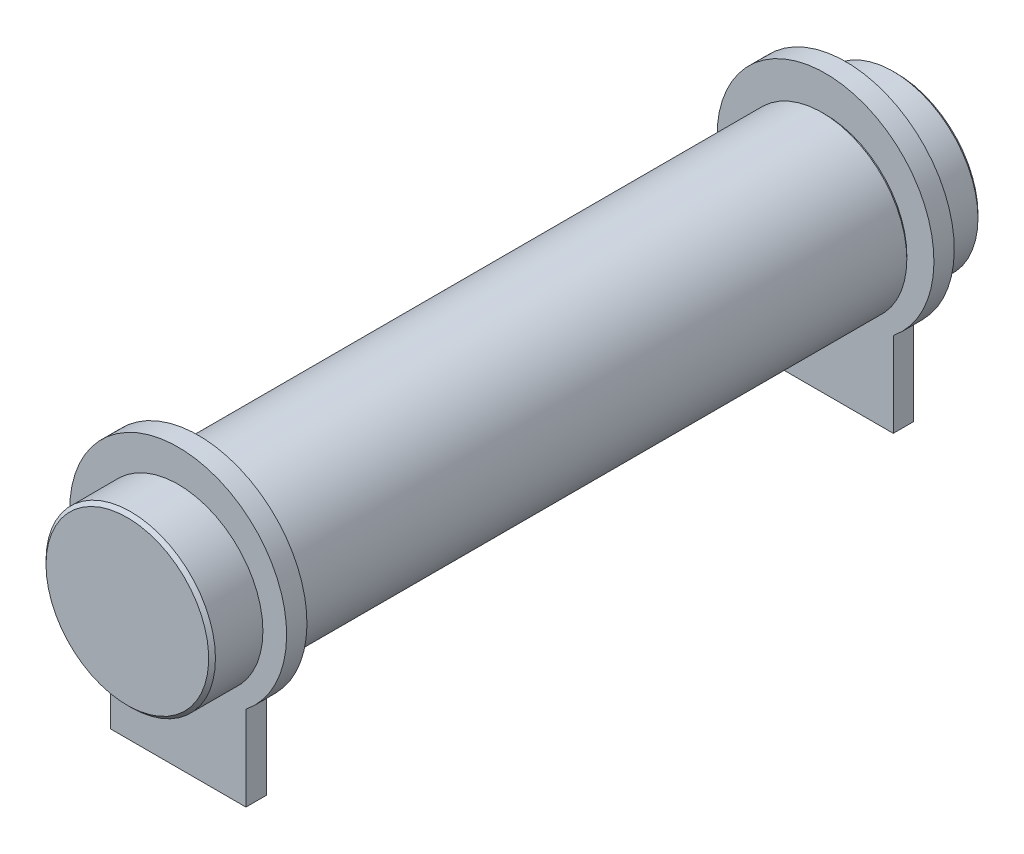
ISO-10303-21;
HEADER;
FILE_DESCRIPTION(('STEP AP214'),'2;1');
FILE_NAME('part.step','',(''),(''),'','','');
FILE_SCHEMA(('AUTOMOTIVE_DESIGN { 1 0 10303 214 1 1 1 1 }'));
ENDSEC;
DATA;
#1=APPLICATION_CONTEXT('core data for automotive mechanical design processes');
#2=APPLICATION_PROTOCOL_DEFINITION('international standard','automotive_design',2000,#1);
#3=PRODUCT_CONTEXT('',#1,'mechanical');
#4=PRODUCT('Part','Part','',(#3));
#5=PRODUCT_RELATED_PRODUCT_CATEGORY('part','',(#4));
#6=PRODUCT_DEFINITION_FORMATION('','',#4);
#7=PRODUCT_DEFINITION_CONTEXT('part definition',#1,'design');
#8=PRODUCT_DEFINITION('design','',#6,#7);
#9=PRODUCT_DEFINITION_SHAPE('','',#8);
#10=(LENGTH_UNIT() NAMED_UNIT(*) SI_UNIT(.MILLI.,.METRE.));
#11=(NAMED_UNIT(*) PLANE_ANGLE_UNIT() SI_UNIT($,.RADIAN.));
#12=(NAMED_UNIT(*) SI_UNIT($,.STERADIAN.) SOLID_ANGLE_UNIT());
#13=UNCERTAINTY_MEASURE_WITH_UNIT(LENGTH_MEASURE(1.E-05),#10,'distance_accuracy_value','');
#14=(GEOMETRIC_REPRESENTATION_CONTEXT(3) GLOBAL_UNCERTAINTY_ASSIGNED_CONTEXT((#13)) GLOBAL_UNIT_ASSIGNED_CONTEXT((#10,
#11,#12)) REPRESENTATION_CONTEXT('',''));
#15=CARTESIAN_POINT('',(0.,0.,0.));
#16=DIRECTION('',(0.,0.,1.));
#17=DIRECTION('',(1.,0.,0.));
#18=AXIS2_PLACEMENT_3D('',#15,#16,#17);
#19=CARTESIAN_POINT('',(2.5,-2.5,9.15));
#20=DIRECTION('',(0.,0.,1.));
#21=DIRECTION('',(0.,1.,0.));
#22=AXIS2_PLACEMENT_3D('',#19,#20,#21);
#23=PLANE('',#22);
#24=CARTESIAN_POINT('',(0.,0.,9.15));
#25=DIRECTION('',(0.,0.,1.));
#26=DIRECTION('',(-1.,0.,0.));
#27=AXIS2_PLACEMENT_3D('',#24,#25,#26);
#28=CIRCLE('',#27,2.5);
#29=CARTESIAN_POINT('',(-2.5,0.,9.15));
#30=VERTEX_POINT('',#29);
#31=EDGE_CURVE('E353',#30,#30,#28,.F.);
#32=ORIENTED_EDGE('',*,*,#31,.F.);
#33=EDGE_LOOP('',(#32));
#34=FACE_BOUND('',#33,.T.);
#35=CARTESIAN_POINT('',(0.,0.,9.15));
#36=DIRECTION('',(0.,0.,-1.));
#37=DIRECTION('',(0.99999999999999,-1.41766347920107E-07,0.));
#38=AXIS2_PLACEMENT_3D('',#35,#36,#37);
#39=CIRCLE('',#38,2.4);
#40=CARTESIAN_POINT('',(2.39999999999998,-3.40239235008257E-07,9.15));
#41=VERTEX_POINT('',#40);
#42=EDGE_CURVE('E348',#41,#41,#39,.T.);
#43=ORIENTED_EDGE('',*,*,#42,.T.);
#44=EDGE_LOOP('',(#43));
#45=FACE_BOUND('',#44,.T.);
#46=ADVANCED_FACE('F16',(#34,#45),#23,.T.);
#47=CARTESIAN_POINT('',(-2.5,-2.49999987914998,-9.15));
#48=DIRECTION('',(0.,0.,-1.));
#49=DIRECTION('',(0.,1.,0.));
#50=AXIS2_PLACEMENT_3D('',#47,#48,#49);
#51=PLANE('',#50);
#52=CARTESIAN_POINT('',(0.,0.,-9.15));
#53=DIRECTION('',(0.,0.,-1.));
#54=DIRECTION('',(0.99999999999999,-1.41721898572201E-07,0.));
#55=AXIS2_PLACEMENT_3D('',#52,#53,#54);
#56=CIRCLE('',#55,2.5);
#57=CARTESIAN_POINT('',(2.49999999999997,-3.54304746430502E-07,-9.15));
#58=VERTEX_POINT('',#57);
#59=EDGE_CURVE('E345',#58,#58,#56,.T.);
#60=ORIENTED_EDGE('',*,*,#59,.T.);
#61=EDGE_LOOP('',(#60));
#62=FACE_BOUND('',#61,.T.);
#63=CARTESIAN_POINT('',(0.,0.,-9.15));
#64=DIRECTION('',(0.,0.,1.));
#65=DIRECTION('',(-1.,0.,0.));
#66=AXIS2_PLACEMENT_3D('',#63,#64,#65);
#67=CIRCLE('',#66,2.4);
#68=CARTESIAN_POINT('',(-2.4,0.,-9.15));
#69=VERTEX_POINT('',#68);
#70=EDGE_CURVE('E103',#69,#69,#67,.F.);
#71=ORIENTED_EDGE('',*,*,#70,.F.);
#72=EDGE_LOOP('',(#71));
#73=FACE_BOUND('',#72,.T.);
#74=ADVANCED_FACE('F246',(#62,#73),#51,.T.);
#75=CARTESIAN_POINT('',(2.,-4.75,9.85));
#76=DIRECTION('',(1.,0.,0.));
#77=DIRECTION('',(0.,0.,-1.));
#78=AXIS2_PLACEMENT_3D('',#75,#76,#77);
#79=PLANE('',#78);
#80=DIRECTION('',(0.,-1.,0.));
#81=VECTOR('',#80,1.);
#82=CARTESIAN_POINT('',(2.,-2.24799919935939,9.85));
#83=LINE('',#82,#81);
#84=CARTESIAN_POINT('',(2.,-4.75,9.85));
#85=VERTEX_POINT('',#84);
#86=CARTESIAN_POINT('',(2.,-2.24799919935939,9.85));
#87=VERTEX_POINT('',#86);
#88=EDGE_CURVE('E84',#85,#87,#83,.F.);
#89=ORIENTED_EDGE('',*,*,#88,.F.);
#90=DIRECTION('',(0.,0.,-1.));
#91=VECTOR('',#90,1.);
#92=CARTESIAN_POINT('',(2.,-4.75,9.85));
#93=LINE('',#92,#91);
#94=CARTESIAN_POINT('',(2.,-4.75,9.25));
#95=VERTEX_POINT('',#94);
#96=EDGE_CURVE('E100',#95,#85,#93,.F.);
#97=ORIENTED_EDGE('',*,*,#96,.F.);
#98=DIRECTION('',(0.,1.,0.));
#99=VECTOR('',#98,1.);
#100=CARTESIAN_POINT('',(2.,-4.75,9.25));
#101=LINE('',#100,#99);
#102=CARTESIAN_POINT('',(2.,-2.24799919935939,9.25));
#103=VERTEX_POINT('',#102);
#104=EDGE_CURVE('E107',#95,#103,#101,.T.);
#105=ORIENTED_EDGE('',*,*,#104,.T.);
#106=DIRECTION('',(0.,0.,1.));
#107=VECTOR('',#106,1.);
#108=CARTESIAN_POINT('',(2.,-2.24799919935939,9.25));
#109=LINE('',#108,#107);
#110=EDGE_CURVE('E102',#103,#87,#109,.T.);
#111=ORIENTED_EDGE('',*,*,#110,.T.);
#112=EDGE_LOOP('',(#89,#97,#105,#111));
#113=FACE_BOUND('',#112,.T.);
#114=ADVANCED_FACE('F98',(#113),#79,.T.);
#115=CARTESIAN_POINT('',(0.,0.249999999999982,9.25));
#116=DIRECTION('',(0.,0.,1.));
#117=DIRECTION('',(0.,1.,0.));
#118=AXIS2_PLACEMENT_3D('',#115,#116,#117);
#119=CYLINDRICAL_SURFACE('',#118,3.2);
#120=DIRECTION('',(0.,0.,1.));
#121=VECTOR('',#120,1.);
#122=CARTESIAN_POINT('',(-1.99999999999999,-2.24799919935939,9.25));
#123=LINE('',#122,#121);
#124=CARTESIAN_POINT('',(-1.99999999999999,-2.24799919935938,9.25));
#125=VERTEX_POINT('',#124);
#126=CARTESIAN_POINT('',(-1.99999999999999,-2.24799919935939,9.85));
#127=VERTEX_POINT('',#126);
#128=EDGE_CURVE('E118',#125,#127,#123,.T.);
#129=ORIENTED_EDGE('',*,*,#128,.T.);
#130=CARTESIAN_POINT('',(0.,0.249999999999982,9.85));
#131=DIRECTION('',(0.,0.,-1.));
#132=DIRECTION('',(-0.624999999999997,-0.780624749799802,0.));
#133=AXIS2_PLACEMENT_3D('',#130,#131,#132);
#134=CIRCLE('',#133,3.2);
#135=EDGE_CURVE('E123',#87,#127,#134,.F.);
#136=ORIENTED_EDGE('',*,*,#135,.F.);
#137=ORIENTED_EDGE('',*,*,#110,.F.);
#138=CARTESIAN_POINT('',(0.,0.249999999999982,9.25));
#139=DIRECTION('',(0.,0.,1.));
#140=DIRECTION('',(0.624999999999997,-0.780624749799802,0.));
#141=AXIS2_PLACEMENT_3D('',#138,#139,#140);
#142=CIRCLE('',#141,3.2);
#143=EDGE_CURVE('E127',#103,#125,#142,.T.);
#144=ORIENTED_EDGE('',*,*,#143,.T.);
#145=EDGE_LOOP('',(#129,#136,#137,#144));
#146=FACE_BOUND('',#145,.T.);
#147=ADVANCED_FACE('F259',(#146),#119,.T.);
#148=CARTESIAN_POINT('',(-2.,-4.75,9.25));
#149=DIRECTION('',(-1.,0.,0.));
#150=DIRECTION('',(0.,0.,1.));
#151=AXIS2_PLACEMENT_3D('',#148,#149,#150);
#152=PLANE('',#151);
#153=DIRECTION('',(0.,1.,0.));
#154=VECTOR('',#153,1.);
#155=CARTESIAN_POINT('',(-2.,-4.75,9.85));
#156=LINE('',#155,#154);
#157=CARTESIAN_POINT('',(-2.,-4.75,9.85));
#158=VERTEX_POINT('',#157);
#159=EDGE_CURVE('E87',#127,#158,#156,.F.);
#160=ORIENTED_EDGE('',*,*,#159,.F.);
#161=ORIENTED_EDGE('',*,*,#128,.F.);
#162=DIRECTION('',(0.,-1.,0.));
#163=VECTOR('',#162,1.);
#164=CARTESIAN_POINT('',(-2.,-2.24799919935939,9.25));
#165=LINE('',#164,#163);
#166=CARTESIAN_POINT('',(-2.,-4.75,9.25));
#167=VERTEX_POINT('',#166);
#168=EDGE_CURVE('E135',#125,#167,#165,.T.);
#169=ORIENTED_EDGE('',*,*,#168,.T.);
#170=DIRECTION('',(0.,0.,1.));
#171=VECTOR('',#170,1.);
#172=CARTESIAN_POINT('',(-2.,-4.75,9.25));
#173=LINE('',#172,#171);
#174=EDGE_CURVE('E93',#167,#158,#173,.T.);
#175=ORIENTED_EDGE('',*,*,#174,.T.);
#176=EDGE_LOOP('',(#160,#161,#169,#175));
#177=FACE_BOUND('',#176,.T.);
#178=ADVANCED_FACE('F262',(#177),#152,.T.);
#179=CARTESIAN_POINT('',(-2.,-4.75,9.85));
#180=DIRECTION('',(0.,-1.,0.));
#181=DIRECTION('',(0.,0.,-1.));
#182=AXIS2_PLACEMENT_3D('',#179,#180,#181);
#183=PLANE('',#182);
#184=DIRECTION('',(-1.,0.,0.));
#185=VECTOR('',#184,1.);
#186=CARTESIAN_POINT('',(2.,-4.75,9.85));
#187=LINE('',#186,#185);
#188=EDGE_CURVE('E80',#158,#85,#187,.F.);
#189=ORIENTED_EDGE('',*,*,#188,.F.);
#190=ORIENTED_EDGE('',*,*,#174,.F.);
#191=DIRECTION('',(1.,0.,0.));
#192=VECTOR('',#191,1.);
#193=CARTESIAN_POINT('',(-2.,-4.75,9.25));
#194=LINE('',#193,#192);
#195=EDGE_CURVE('E92',#167,#95,#194,.T.);
#196=ORIENTED_EDGE('',*,*,#195,.T.);
#197=ORIENTED_EDGE('',*,*,#96,.T.);
#198=EDGE_LOOP('',(#189,#190,#196,#197));
#199=FACE_BOUND('',#198,.T.);
#200=ADVANCED_FACE('F106',(#199),#183,.T.);
#201=CARTESIAN_POINT('',(-3.21954510231242,-4.75,9.25));
#202=DIRECTION('',(0.,0.,-1.));
#203=DIRECTION('',(0.,1.,0.));
#204=AXIS2_PLACEMENT_3D('',#201,#202,#203);
#205=PLANE('',#204);
#206=ORIENTED_EDGE('',*,*,#143,.F.);
#207=ORIENTED_EDGE('',*,*,#104,.F.);
#208=ORIENTED_EDGE('',*,*,#195,.F.);
#209=ORIENTED_EDGE('',*,*,#168,.F.);
#210=EDGE_LOOP('',(#206,#207,#208,#209));
#211=FACE_BOUND('',#210,.T.);
#212=CARTESIAN_POINT('',(0.,0.,9.25));
#213=DIRECTION('',(0.,0.,1.));
#214=DIRECTION('',(-0.99999999999999,-1.42053887171776E-07,0.));
#215=AXIS2_PLACEMENT_3D('',#212,#213,#214);
#216=CIRCLE('',#215,2.4);
#217=CARTESIAN_POINT('',(-2.39999999999998,-3.40929329212263E-07,9.25));
#218=VERTEX_POINT('',#217);
#219=EDGE_CURVE('E148',#218,#218,#216,.T.);
#220=ORIENTED_EDGE('',*,*,#219,.T.);
#221=EDGE_LOOP('',(#220));
#222=FACE_BOUND('',#221,.T.);
#223=ADVANCED_FACE('F243',(#211,#222),#205,.T.);
#224=CARTESIAN_POINT('',(-3.21954510231242,-4.75,9.85));
#225=DIRECTION('',(0.,0.,1.));
#226=DIRECTION('',(1.,0.,0.));
#227=AXIS2_PLACEMENT_3D('',#224,#225,#226);
#228=PLANE('',#227);
#229=ORIENTED_EDGE('',*,*,#88,.T.);
#230=ORIENTED_EDGE('',*,*,#135,.T.);
#231=ORIENTED_EDGE('',*,*,#159,.T.);
#232=ORIENTED_EDGE('',*,*,#188,.T.);
#233=EDGE_LOOP('',(#229,#230,#231,#232));
#234=FACE_BOUND('',#233,.T.);
#235=CARTESIAN_POINT('',(0.,0.,9.85));
#236=DIRECTION('',(0.,0.,-1.));
#237=DIRECTION('',(0.99999999999999,-1.42053901797114E-07,0.));
#238=AXIS2_PLACEMENT_3D('',#235,#236,#237);
#239=CIRCLE('',#238,2.5);
#240=CARTESIAN_POINT('',(2.49999999999997,-3.55134754492786E-07,9.85));
#241=VERTEX_POINT('',#240);
#242=EDGE_CURVE('E153',#241,#241,#239,.T.);
#243=ORIENTED_EDGE('',*,*,#242,.T.);
#244=EDGE_LOOP('',(#243));
#245=FACE_BOUND('',#244,.T.);
#246=ADVANCED_FACE('F82',(#234,#245),#228,.T.);
#247=CARTESIAN_POINT('',(2.40000018407145,-2.39999988382605,11.35));
#248=DIRECTION('',(0.,0.,1.));
#249=DIRECTION('',(0.,1.,0.));
#250=AXIS2_PLACEMENT_3D('',#247,#248,#249);
#251=PLANE('',#250);
#252=CARTESIAN_POINT('',(0.,0.,11.35));
#253=DIRECTION('',(0.,0.,1.));
#254=DIRECTION('',(-1.,0.,0.));
#255=AXIS2_PLACEMENT_3D('',#252,#253,#254);
#256=CIRCLE('',#255,2.4);
#257=CARTESIAN_POINT('',(-2.4,0.,11.35));
#258=VERTEX_POINT('',#257);
#259=EDGE_CURVE('E156',#258,#258,#256,.F.);
#260=ORIENTED_EDGE('',*,*,#259,.F.);
#261=EDGE_LOOP('',(#260));
#262=FACE_BOUND('',#261,.T.);
#263=ADVANCED_FACE('F231',(#262),#251,.T.);
#264=CARTESIAN_POINT('',(2.,-4.75,-9.85));
#265=DIRECTION('',(1.,0.,0.));
#266=DIRECTION('',(0.,1.,0.));
#267=AXIS2_PLACEMENT_3D('',#264,#265,#266);
#268=PLANE('',#267);
#269=DIRECTION('',(0.,1.,0.));
#270=VECTOR('',#269,1.);
#271=CARTESIAN_POINT('',(2.,-4.75,-9.85));
#272=LINE('',#271,#270);
#273=CARTESIAN_POINT('',(2.,-4.75,-9.85));
#274=VERTEX_POINT('',#273);
#275=CARTESIAN_POINT('',(2.,-2.24799919935939,-9.85));
#276=VERTEX_POINT('',#275);
#277=EDGE_CURVE('E159',#274,#276,#272,.T.);
#278=ORIENTED_EDGE('',*,*,#277,.T.);
#279=DIRECTION('',(0.,0.,1.));
#280=VECTOR('',#279,1.);
#281=CARTESIAN_POINT('',(2.,-2.24799919935939,-9.85));
#282=LINE('',#281,#280);
#283=CARTESIAN_POINT('',(2.,-2.24799919935939,-9.25));
#284=VERTEX_POINT('',#283);
#285=EDGE_CURVE('E162',#284,#276,#282,.F.);
#286=ORIENTED_EDGE('',*,*,#285,.F.);
#287=DIRECTION('',(0.,-1.,0.));
#288=VECTOR('',#287,1.);
#289=CARTESIAN_POINT('',(2.,-2.24799919935939,-9.25));
#290=LINE('',#289,#288);
#291=CARTESIAN_POINT('',(2.,-4.75,-9.25));
#292=VERTEX_POINT('',#291);
#293=EDGE_CURVE('E167',#292,#284,#290,.F.);
#294=ORIENTED_EDGE('',*,*,#293,.F.);
#295=DIRECTION('',(0.,0.,-1.));
#296=VECTOR('',#295,1.);
#297=CARTESIAN_POINT('',(2.,-4.75,-9.25));
#298=LINE('',#297,#296);
#299=EDGE_CURVE('E171',#292,#274,#298,.T.);
#300=ORIENTED_EDGE('',*,*,#299,.T.);
#301=EDGE_LOOP('',(#278,#286,#294,#300));
#302=FACE_BOUND('',#301,.T.);
#303=ADVANCED_FACE('F233',(#302),#268,.T.);
#304=CARTESIAN_POINT('',(0.,0.249999999999982,-9.25));
#305=DIRECTION('',(0.,0.,-1.));
#306=DIRECTION('',(0.,1.,0.));
#307=AXIS2_PLACEMENT_3D('',#304,#305,#306);
#308=CYLINDRICAL_SURFACE('',#307,3.2);
#309=ORIENTED_EDGE('',*,*,#285,.T.);
#310=CARTESIAN_POINT('',(0.,0.249999999999982,-9.85));
#311=DIRECTION('',(0.,0.,1.));
#312=DIRECTION('',(0.624999999999997,-0.780624749799802,0.));
#313=AXIS2_PLACEMENT_3D('',#310,#311,#312);
#314=CIRCLE('',#313,3.2);
#315=CARTESIAN_POINT('',(-1.99999999999999,-2.24799919935938,-9.85));
#316=VERTEX_POINT('',#315);
#317=EDGE_CURVE('E176',#276,#316,#314,.T.);
#318=ORIENTED_EDGE('',*,*,#317,.T.);
#319=DIRECTION('',(0.,0.,1.));
#320=VECTOR('',#319,1.);
#321=CARTESIAN_POINT('',(-1.99999999999999,-2.24799919935938,-9.85));
#322=LINE('',#321,#320);
#323=CARTESIAN_POINT('',(-1.99999999999999,-2.24799919935938,-9.25));
#324=VERTEX_POINT('',#323);
#325=EDGE_CURVE('E181',#324,#316,#322,.F.);
#326=ORIENTED_EDGE('',*,*,#325,.F.);
#327=CARTESIAN_POINT('',(0.,0.249999999999982,-9.25));
#328=DIRECTION('',(0.,0.,-1.));
#329=DIRECTION('',(-0.624999999999997,-0.780624749799802,0.));
#330=AXIS2_PLACEMENT_3D('',#327,#328,#329);
#331=CIRCLE('',#330,3.2);
#332=EDGE_CURVE('E186',#284,#324,#331,.F.);
#333=ORIENTED_EDGE('',*,*,#332,.F.);
#334=EDGE_LOOP('',(#309,#318,#326,#333));
#335=FACE_BOUND('',#334,.T.);
#336=ADVANCED_FACE('F240',(#335),#308,.T.);
#337=CARTESIAN_POINT('',(-2.,-4.75,-9.25));
#338=DIRECTION('',(-1.,0.,0.));
#339=DIRECTION('',(0.,1.,0.));
#340=AXIS2_PLACEMENT_3D('',#337,#338,#339);
#341=PLANE('',#340);
#342=DIRECTION('',(0.,-1.,0.));
#343=VECTOR('',#342,1.);
#344=CARTESIAN_POINT('',(-2.,-2.24799919935939,-9.85));
#345=LINE('',#344,#343);
#346=CARTESIAN_POINT('',(-2.,-4.75,-9.85));
#347=VERTEX_POINT('',#346);
#348=EDGE_CURVE('E190',#316,#347,#345,.T.);
#349=ORIENTED_EDGE('',*,*,#348,.T.);
#350=DIRECTION('',(0.,0.,1.));
#351=VECTOR('',#350,1.);
#352=CARTESIAN_POINT('',(-2.,-4.75,-9.85));
#353=LINE('',#352,#351);
#354=CARTESIAN_POINT('',(-2.,-4.75,-9.25));
#355=VERTEX_POINT('',#354);
#356=EDGE_CURVE('E194',#355,#347,#353,.F.);
#357=ORIENTED_EDGE('',*,*,#356,.F.);
#358=DIRECTION('',(0.,1.,0.));
#359=VECTOR('',#358,1.);
#360=CARTESIAN_POINT('',(-2.,-4.75,-9.25));
#361=LINE('',#360,#359);
#362=EDGE_CURVE('E31',#324,#355,#361,.F.);
#363=ORIENTED_EDGE('',*,*,#362,.F.);
#364=ORIENTED_EDGE('',*,*,#325,.T.);
#365=EDGE_LOOP('',(#349,#357,#363,#364));
#366=FACE_BOUND('',#365,.T.);
#367=ADVANCED_FACE('F324',(#366),#341,.T.);
#368=CARTESIAN_POINT('',(-2.,-4.75,-9.85));
#369=DIRECTION('',(0.,-1.,0.));
#370=DIRECTION('',(1.,0.,0.));
#371=AXIS2_PLACEMENT_3D('',#368,#369,#370);
#372=PLANE('',#371);
#373=DIRECTION('',(1.,0.,0.));
#374=VECTOR('',#373,1.);
#375=CARTESIAN_POINT('',(-2.,-4.75,-9.85));
#376=LINE('',#375,#374);
#377=EDGE_CURVE('E39',#347,#274,#376,.T.);
#378=ORIENTED_EDGE('',*,*,#377,.T.);
#379=ORIENTED_EDGE('',*,*,#299,.F.);
#380=DIRECTION('',(-1.,0.,0.));
#381=VECTOR('',#380,1.);
#382=CARTESIAN_POINT('',(2.,-4.75,-9.25));
#383=LINE('',#382,#381);
#384=EDGE_CURVE('E205',#355,#292,#383,.F.);
#385=ORIENTED_EDGE('',*,*,#384,.F.);
#386=ORIENTED_EDGE('',*,*,#356,.T.);
#387=EDGE_LOOP('',(#378,#379,#385,#386));
#388=FACE_BOUND('',#387,.T.);
#389=ADVANCED_FACE('F319',(#388),#372,.T.);
#390=CARTESIAN_POINT('',(-3.21954510231242,-4.75,-9.25));
#391=DIRECTION('',(0.,0.,1.));
#392=DIRECTION('',(1.,0.,0.));
#393=AXIS2_PLACEMENT_3D('',#390,#391,#392);
#394=PLANE('',#393);
#395=ORIENTED_EDGE('',*,*,#293,.T.);
#396=ORIENTED_EDGE('',*,*,#332,.T.);
#397=ORIENTED_EDGE('',*,*,#362,.T.);
#398=ORIENTED_EDGE('',*,*,#384,.T.);
#399=EDGE_LOOP('',(#395,#396,#397,#398));
#400=FACE_BOUND('',#399,.T.);
#401=CARTESIAN_POINT('',(0.,0.,-9.25));
#402=DIRECTION('',(0.,0.,-1.));
#403=DIRECTION('',(0.99999999999999,-1.42053887541851E-07,0.));
#404=AXIS2_PLACEMENT_3D('',#401,#402,#403);
#405=CIRCLE('',#404,2.4);
#406=CARTESIAN_POINT('',(2.39999999999998,-3.40929330100441E-07,-9.25));
#407=VERTEX_POINT('',#406);
#408=EDGE_CURVE('E209',#407,#407,#405,.F.);
#409=ORIENTED_EDGE('',*,*,#408,.F.);
#410=EDGE_LOOP('',(#409));
#411=FACE_BOUND('',#410,.T.);
#412=ADVANCED_FACE('F315',(#400,#411),#394,.T.);
#413=CARTESIAN_POINT('',(-3.21954510231242,-4.75,-9.85));
#414=DIRECTION('',(0.,0.,-1.));
#415=DIRECTION('',(0.,1.,0.));
#416=AXIS2_PLACEMENT_3D('',#413,#414,#415);
#417=PLANE('',#416);
#418=ORIENTED_EDGE('',*,*,#317,.F.);
#419=ORIENTED_EDGE('',*,*,#277,.F.);
#420=ORIENTED_EDGE('',*,*,#377,.F.);
#421=ORIENTED_EDGE('',*,*,#348,.F.);
#422=EDGE_LOOP('',(#418,#419,#420,#421));
#423=FACE_BOUND('',#422,.T.);
#424=CARTESIAN_POINT('',(0.,0.,-9.85));
#425=DIRECTION('',(0.,0.,1.));
#426=DIRECTION('',(-0.99999999999999,-1.42053902152386E-07,0.));
#427=AXIS2_PLACEMENT_3D('',#424,#425,#426);
#428=CIRCLE('',#427,2.5);
#429=CARTESIAN_POINT('',(-2.49999999999997,-3.55134755380964E-07,-9.85));
#430=VERTEX_POINT('',#429);
#431=EDGE_CURVE('E214',#430,#430,#428,.T.);
#432=ORIENTED_EDGE('',*,*,#431,.T.);
#433=EDGE_LOOP('',(#432));
#434=FACE_BOUND('',#433,.T.);
#435=ADVANCED_FACE('F288',(#423,#434),#417,.T.);
#436=CARTESIAN_POINT('',(-2.4,-2.39999988398397,-11.35));
#437=DIRECTION('',(0.,0.,-1.));
#438=DIRECTION('',(0.,1.,0.));
#439=AXIS2_PLACEMENT_3D('',#436,#437,#438);
#440=PLANE('',#439);
#441=CARTESIAN_POINT('',(0.,0.,-11.35));
#442=DIRECTION('',(0.,0.,-1.));
#443=DIRECTION('',(0.99999999999999,-1.41721915684439E-07,0.));
#444=AXIS2_PLACEMENT_3D('',#441,#442,#443);
#445=CIRCLE('',#444,2.4);
#446=CARTESIAN_POINT('',(2.39999999999998,-3.40132597642653E-07,-11.35));
#447=VERTEX_POINT('',#446);
#448=EDGE_CURVE('E217',#447,#447,#445,.T.);
#449=ORIENTED_EDGE('',*,*,#448,.T.);
#450=EDGE_LOOP('',(#449));
#451=FACE_BOUND('',#450,.T.);
#452=ADVANCED_FACE('F279',(#451),#440,.T.);
#453=CARTESIAN_POINT('',(0.,0.,-50.));
#454=DIRECTION('',(0.,0.,-1.));
#455=DIRECTION('',(1.,0.,0.));
#456=AXIS2_PLACEMENT_3D('',#453,#454,#455);
#457=CYLINDRICAL_SURFACE('',#456,2.4);
#458=ORIENTED_EDGE('',*,*,#42,.F.);
#459=EDGE_LOOP('',(#458));
#460=FACE_BOUND('',#459,.T.);
#461=ORIENTED_EDGE('',*,*,#219,.F.);
#462=EDGE_LOOP('',(#461));
#463=FACE_BOUND('',#462,.T.);
#464=ADVANCED_FACE('F276',(#460,#463),#457,.T.);
#465=CARTESIAN_POINT('',(0.,0.,-50.));
#466=DIRECTION('',(0.,0.,-1.));
#467=DIRECTION('',(1.,0.,0.));
#468=AXIS2_PLACEMENT_3D('',#465,#466,#467);
#469=CYLINDRICAL_SURFACE('',#468,2.5);
#470=ORIENTED_EDGE('',*,*,#59,.F.);
#471=EDGE_LOOP('',(#470));
#472=FACE_BOUND('',#471,.T.);
#473=ORIENTED_EDGE('',*,*,#31,.T.);
#474=EDGE_LOOP('',(#473));
#475=FACE_BOUND('',#474,.T.);
#476=ADVANCED_FACE('F278',(#472,#475),#469,.T.);
#477=CARTESIAN_POINT('',(0.,0.,-50.));
#478=DIRECTION('',(0.,0.,-1.));
#479=DIRECTION('',(1.,0.,0.));
#480=AXIS2_PLACEMENT_3D('',#477,#478,#479);
#481=CYLINDRICAL_SURFACE('',#480,2.4);
#482=ORIENTED_EDGE('',*,*,#408,.T.);
#483=EDGE_LOOP('',(#482));
#484=FACE_BOUND('',#483,.T.);
#485=ORIENTED_EDGE('',*,*,#70,.T.);
#486=EDGE_LOOP('',(#485));
#487=FACE_BOUND('',#486,.T.);
#488=ADVANCED_FACE('F227',(#484,#487),#481,.T.);
#489=CARTESIAN_POINT('',(0.,0.,11.25));
#490=DIRECTION('',(0.,0.,-1.));
#491=DIRECTION('',(1.,1.92343152856519E-10,0.));
#492=AXIS2_PLACEMENT_3D('',#489,#490,#491);
#493=CONICAL_SURFACE('',#492,2.5,0.785398163397435);
#494=CARTESIAN_POINT('',(0.,0.,11.25));
#495=DIRECTION('',(0.,0.,1.));
#496=DIRECTION('',(-1.,0.,0.));
#497=AXIS2_PLACEMENT_3D('',#494,#495,#496);
#498=CIRCLE('',#497,2.5);
#499=CARTESIAN_POINT('',(-2.5,0.,11.25));
#500=VERTEX_POINT('',#499);
#501=EDGE_CURVE('E24',#500,#500,#498,.F.);
#502=ORIENTED_EDGE('',*,*,#501,.F.);
#503=EDGE_LOOP('',(#502));
#504=FACE_BOUND('',#503,.T.);
#505=ORIENTED_EDGE('',*,*,#259,.T.);
#506=EDGE_LOOP('',(#505));
#507=FACE_BOUND('',#506,.T.);
#508=ADVANCED_FACE('F224',(#504,#507),#493,.T.);
#509=CARTESIAN_POINT('',(0.,0.,-50.));
#510=DIRECTION('',(0.,0.,-1.));
#511=DIRECTION('',(1.,7.69370911764408E-10,0.));
#512=AXIS2_PLACEMENT_3D('',#509,#510,#511);
#513=CYLINDRICAL_SURFACE('',#512,2.5);
#514=ORIENTED_EDGE('',*,*,#242,.F.);
#515=EDGE_LOOP('',(#514));
#516=FACE_BOUND('',#515,.T.);
#517=ORIENTED_EDGE('',*,*,#501,.T.);
#518=EDGE_LOOP('',(#517));
#519=FACE_BOUND('',#518,.T.);
#520=ADVANCED_FACE('F222',(#516,#519),#513,.T.);
#521=CARTESIAN_POINT('',(0.,0.,-11.25));
#522=DIRECTION('',(0.,0.,1.));
#523=DIRECTION('',(-1.,0.,0.));
#524=AXIS2_PLACEMENT_3D('',#521,#522,#523);
#525=CONICAL_SURFACE('',#524,2.5,0.785398163397435);
#526=ORIENTED_EDGE('',*,*,#448,.F.);
#527=EDGE_LOOP('',(#526));
#528=FACE_BOUND('',#527,.T.);
#529=CARTESIAN_POINT('',(0.,0.,-11.25));
#530=DIRECTION('',(0.,0.,-1.));
#531=DIRECTION('',(1.,0.,0.));
#532=AXIS2_PLACEMENT_3D('',#529,#530,#531);
#533=CIRCLE('',#532,2.5);
#534=CARTESIAN_POINT('',(2.5,0.,-11.25));
#535=VERTEX_POINT('',#534);
#536=EDGE_CURVE('E10',#535,#535,#533,.T.);
#537=ORIENTED_EDGE('',*,*,#536,.T.);
#538=EDGE_LOOP('',(#537));
#539=FACE_BOUND('',#538,.T.);
#540=ADVANCED_FACE('F298',(#528,#539),#525,.T.);
#541=CARTESIAN_POINT('',(0.,0.,-50.));
#542=DIRECTION('',(0.,0.,-1.));
#543=DIRECTION('',(1.,0.,0.));
#544=AXIS2_PLACEMENT_3D('',#541,#542,#543);
#545=CYLINDRICAL_SURFACE('',#544,2.5);
#546=ORIENTED_EDGE('',*,*,#431,.F.);
#547=EDGE_LOOP('',(#546));
#548=FACE_BOUND('',#547,.T.);
#549=ORIENTED_EDGE('',*,*,#536,.F.);
#550=EDGE_LOOP('',(#549));
#551=FACE_BOUND('',#550,.T.);
#552=ADVANCED_FACE('F18',(#548,#551),#545,.T.);
#553=CLOSED_SHELL('',(#46,#74,#114,#147,#178,#200,#223,#246,#263,#303,#336,#367,#389,#412,#435,
#452,#464,#476,#488,#508,#520,#540,#552));
#554=MANIFOLD_SOLID_BREP('B1',#553);
#555=ADVANCED_BREP_SHAPE_REPRESENTATION('',(#18,#554),#14);
#556=SHAPE_DEFINITION_REPRESENTATION(#9,#555);
ENDSEC;
END-ISO-10303-21;
